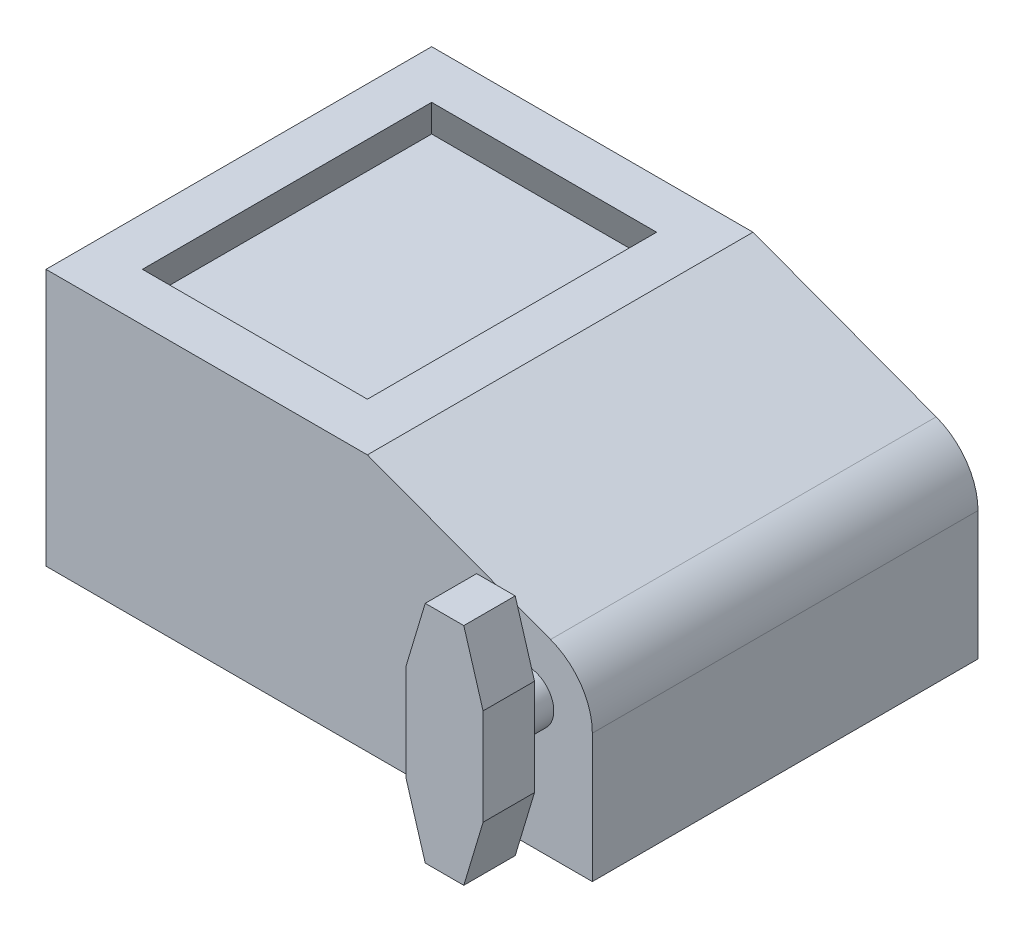
ISO-10303-21;
HEADER;
FILE_DESCRIPTION(('STEP AP214'),'2;1');
FILE_NAME('part.step','',(''),(''),'','','');
FILE_SCHEMA(('AUTOMOTIVE_DESIGN { 1 0 10303 214 1 1 1 1 }'));
ENDSEC;
DATA;
#1=APPLICATION_CONTEXT('core data for automotive mechanical design processes');
#2=APPLICATION_PROTOCOL_DEFINITION('international standard','automotive_design',2000,#1);
#3=PRODUCT_CONTEXT('',#1,'mechanical');
#4=PRODUCT('Part','Part','',(#3));
#5=PRODUCT_RELATED_PRODUCT_CATEGORY('part','',(#4));
#6=PRODUCT_DEFINITION_FORMATION('','',#4);
#7=PRODUCT_DEFINITION_CONTEXT('part definition',#1,'design');
#8=PRODUCT_DEFINITION('design','',#6,#7);
#9=PRODUCT_DEFINITION_SHAPE('','',#8);
#10=(LENGTH_UNIT() NAMED_UNIT(*) SI_UNIT(.MILLI.,.METRE.));
#11=(NAMED_UNIT(*) PLANE_ANGLE_UNIT() SI_UNIT($,.RADIAN.));
#12=(NAMED_UNIT(*) SI_UNIT($,.STERADIAN.) SOLID_ANGLE_UNIT());
#13=UNCERTAINTY_MEASURE_WITH_UNIT(LENGTH_MEASURE(1.E-05),#10,'distance_accuracy_value','');
#14=(GEOMETRIC_REPRESENTATION_CONTEXT(3) GLOBAL_UNCERTAINTY_ASSIGNED_CONTEXT((#13)) GLOBAL_UNIT_ASSIGNED_CONTEXT((#10,
#11,#12)) REPRESENTATION_CONTEXT('',''));
#15=CARTESIAN_POINT('',(0.,0.,0.));
#16=DIRECTION('',(0.,0.,1.));
#17=DIRECTION('',(1.,0.,0.));
#18=AXIS2_PLACEMENT_3D('',#15,#16,#17);
#19=CARTESIAN_POINT('',(0.,40.,0.));
#20=DIRECTION('',(0.,-1.,0.));
#21=DIRECTION('',(0.,0.,-1.));
#22=AXIS2_PLACEMENT_3D('',#19,#20,#21);
#23=PLANE('',#22);
#24=DIRECTION('',(0.,0.,-1.));
#25=VECTOR('',#24,1.);
#26=CARTESIAN_POINT('',(25.,40.,30.));
#27=LINE('',#26,#25);
#28=CARTESIAN_POINT('',(25.,40.,30.));
#29=VERTEX_POINT('',#28);
#30=CARTESIAN_POINT('',(25.,40.,-30.));
#31=VERTEX_POINT('',#30);
#32=EDGE_CURVE('E250',#29,#31,#27,.T.);
#33=ORIENTED_EDGE('',*,*,#32,.T.);
#34=DIRECTION('',(-1.,0.,0.));
#35=VECTOR('',#34,1.);
#36=CARTESIAN_POINT('',(-25.,40.,-30.));
#37=LINE('',#36,#35);
#38=CARTESIAN_POINT('',(-25.,40.,-30.));
#39=VERTEX_POINT('',#38);
#40=EDGE_CURVE('E253',#31,#39,#37,.T.);
#41=ORIENTED_EDGE('',*,*,#40,.T.);
#42=DIRECTION('',(0.,0.,1.));
#43=VECTOR('',#42,1.);
#44=CARTESIAN_POINT('',(-25.,40.,30.));
#45=LINE('',#44,#43);
#46=CARTESIAN_POINT('',(-25.,40.,30.));
#47=VERTEX_POINT('',#46);
#48=EDGE_CURVE('E256',#39,#47,#45,.T.);
#49=ORIENTED_EDGE('',*,*,#48,.T.);
#50=DIRECTION('',(1.,0.,0.));
#51=VECTOR('',#50,1.);
#52=CARTESIAN_POINT('',(-25.,40.,30.));
#53=LINE('',#52,#51);
#54=EDGE_CURVE('E258',#47,#29,#53,.T.);
#55=ORIENTED_EDGE('',*,*,#54,.T.);
#56=EDGE_LOOP('',(#33,#41,#49,#55));
#57=FACE_BOUND('',#56,.T.);
#58=DIRECTION('',(0.,0.,-1.));
#59=VECTOR('',#58,1.);
#60=CARTESIAN_POINT('',(-17.5,40.,22.5));
#61=LINE('',#60,#59);
#62=CARTESIAN_POINT('',(-17.5,40.,22.5));
#63=VERTEX_POINT('',#62);
#64=CARTESIAN_POINT('',(-17.5,40.,-22.5));
#65=VERTEX_POINT('',#64);
#66=EDGE_CURVE('E189',#63,#65,#61,.T.);
#67=ORIENTED_EDGE('',*,*,#66,.T.);
#68=DIRECTION('',(1.,0.,0.));
#69=VECTOR('',#68,1.);
#70=CARTESIAN_POINT('',(-17.5,40.,-22.5));
#71=LINE('',#70,#69);
#72=CARTESIAN_POINT('',(17.5,40.,-22.5));
#73=VERTEX_POINT('',#72);
#74=EDGE_CURVE('E178',#65,#73,#71,.T.);
#75=ORIENTED_EDGE('',*,*,#74,.T.);
#76=DIRECTION('',(0.,0.,-1.));
#77=VECTOR('',#76,1.);
#78=CARTESIAN_POINT('',(17.5,40.,22.5));
#79=LINE('',#78,#77);
#80=CARTESIAN_POINT('',(17.5,40.,22.5));
#81=VERTEX_POINT('',#80);
#82=EDGE_CURVE('E188',#81,#73,#79,.T.);
#83=ORIENTED_EDGE('',*,*,#82,.F.);
#84=DIRECTION('',(1.,0.,0.));
#85=VECTOR('',#84,1.);
#86=CARTESIAN_POINT('',(-17.5,40.,22.5));
#87=LINE('',#86,#85);
#88=EDGE_CURVE('E201',#63,#81,#87,.T.);
#89=ORIENTED_EDGE('',*,*,#88,.F.);
#90=EDGE_LOOP('',(#67,#75,#83,#89));
#91=FACE_BOUND('',#90,.T.);
#92=ADVANCED_FACE('F53',(#57,#91),#23,.F.);
#93=CARTESIAN_POINT('',(-25.,40.,-30.));
#94=DIRECTION('',(0.,0.,1.));
#95=DIRECTION('',(1.,0.,0.));
#96=AXIS2_PLACEMENT_3D('',#93,#94,#95);
#97=PLANE('',#96);
#98=DIRECTION('',(-1.,0.,0.));
#99=VECTOR('',#98,1.);
#100=CARTESIAN_POINT('',(-25.,0.,-30.));
#101=LINE('',#100,#99);
#102=CARTESIAN_POINT('',(60.,0.,-30.));
#103=VERTEX_POINT('',#102);
#104=CARTESIAN_POINT('',(-25.,0.,-30.));
#105=VERTEX_POINT('',#104);
#106=EDGE_CURVE('E228',#103,#105,#101,.T.);
#107=ORIENTED_EDGE('',*,*,#106,.T.);
#108=DIRECTION('',(0.,-1.,0.));
#109=VECTOR('',#108,1.);
#110=CARTESIAN_POINT('',(-25.,40.,-30.));
#111=LINE('',#110,#109);
#112=EDGE_CURVE('E267',#39,#105,#111,.T.);
#113=ORIENTED_EDGE('',*,*,#112,.F.);
#114=ORIENTED_EDGE('',*,*,#40,.F.);
#115=DIRECTION('',(-0.936922259792466,0.349537807833973,0.));
#116=VECTOR('',#115,1.);
#117=CARTESIAN_POINT('',(16.1540070895829,43.3001766557526,-30.));
#118=LINE('',#117,#116);
#119=CARTESIAN_POINT('',(53.4953780783397,29.3692225979247,-30.));
#120=VERTEX_POINT('',#119);
#121=EDGE_CURVE('E229',#120,#31,#118,.T.);
#122=ORIENTED_EDGE('',*,*,#121,.F.);
#123=CARTESIAN_POINT('',(50.,20.,-30.));
#124=DIRECTION('',(0.,0.,1.));
#125=DIRECTION('',(1.,0.,0.));
#126=AXIS2_PLACEMENT_3D('',#123,#124,#125);
#127=CIRCLE('',#126,10.);
#128=CARTESIAN_POINT('',(60.,20.,-30.));
#129=VERTEX_POINT('',#128);
#130=EDGE_CURVE('E234',#120,#129,#127,.F.);
#131=ORIENTED_EDGE('',*,*,#130,.T.);
#132=DIRECTION('',(0.,1.,0.));
#133=VECTOR('',#132,1.);
#134=CARTESIAN_POINT('',(60.,0.,-30.));
#135=LINE('',#134,#133);
#136=EDGE_CURVE('E225',#103,#129,#135,.T.);
#137=ORIENTED_EDGE('',*,*,#136,.F.);
#138=EDGE_LOOP('',(#107,#113,#114,#122,#131,#137));
#139=FACE_BOUND('',#138,.T.);
#140=ADVANCED_FACE('F362',(#139),#97,.F.);
#141=CARTESIAN_POINT('',(-25.,40.,30.));
#142=DIRECTION('',(1.,0.,0.));
#143=DIRECTION('',(0.,0.,-1.));
#144=AXIS2_PLACEMENT_3D('',#141,#142,#143);
#145=PLANE('',#144);
#146=DIRECTION('',(0.,0.,1.));
#147=VECTOR('',#146,1.);
#148=CARTESIAN_POINT('',(-25.,0.,30.));
#149=LINE('',#148,#147);
#150=CARTESIAN_POINT('',(-25.,0.,30.));
#151=VERTEX_POINT('',#150);
#152=EDGE_CURVE('E262',#105,#151,#149,.T.);
#153=ORIENTED_EDGE('',*,*,#152,.T.);
#154=DIRECTION('',(0.,-1.,0.));
#155=VECTOR('',#154,1.);
#156=CARTESIAN_POINT('',(-25.,40.,30.));
#157=LINE('',#156,#155);
#158=EDGE_CURVE('E260',#47,#151,#157,.T.);
#159=ORIENTED_EDGE('',*,*,#158,.F.);
#160=ORIENTED_EDGE('',*,*,#48,.F.);
#161=ORIENTED_EDGE('',*,*,#112,.T.);
#162=EDGE_LOOP('',(#153,#159,#160,#161));
#163=FACE_BOUND('',#162,.T.);
#164=ADVANCED_FACE('F368',(#163),#145,.F.);
#165=CARTESIAN_POINT('',(-25.,40.,30.));
#166=DIRECTION('',(0.,0.,-1.));
#167=DIRECTION('',(-1.,0.,0.));
#168=AXIS2_PLACEMENT_3D('',#165,#166,#167);
#169=PLANE('',#168);
#170=CARTESIAN_POINT('',(50.,20.,30.));
#171=DIRECTION('',(0.,0.,-1.));
#172=DIRECTION('',(-1.,0.,0.));
#173=AXIS2_PLACEMENT_3D('',#170,#171,#172);
#174=CIRCLE('',#173,4.00000000000001);
#175=CARTESIAN_POINT('',(46.,20.,30.));
#176=VERTEX_POINT('',#175);
#177=EDGE_CURVE('E270',#176,#176,#174,.F.);
#178=ORIENTED_EDGE('',*,*,#177,.F.);
#179=EDGE_LOOP('',(#178));
#180=FACE_BOUND('',#179,.T.);
#181=DIRECTION('',(1.,0.,0.));
#182=VECTOR('',#181,1.);
#183=CARTESIAN_POINT('',(-25.,0.,30.));
#184=LINE('',#183,#182);
#185=CARTESIAN_POINT('',(60.,0.,30.));
#186=VERTEX_POINT('',#185);
#187=EDGE_CURVE('E254',#151,#186,#184,.T.);
#188=ORIENTED_EDGE('',*,*,#187,.T.);
#189=DIRECTION('',(0.,-1.,0.));
#190=VECTOR('',#189,1.);
#191=CARTESIAN_POINT('',(60.,0.,30.));
#192=LINE('',#191,#190);
#193=CARTESIAN_POINT('',(60.,20.,30.));
#194=VERTEX_POINT('',#193);
#195=EDGE_CURVE('E233',#194,#186,#192,.T.);
#196=ORIENTED_EDGE('',*,*,#195,.F.);
#197=CARTESIAN_POINT('',(50.,20.,30.));
#198=DIRECTION('',(0.,0.,1.));
#199=DIRECTION('',(1.,0.,0.));
#200=AXIS2_PLACEMENT_3D('',#197,#198,#199);
#201=CIRCLE('',#200,10.);
#202=CARTESIAN_POINT('',(53.4953780783397,29.3692225979247,30.));
#203=VERTEX_POINT('',#202);
#204=EDGE_CURVE('E197',#194,#203,#201,.T.);
#205=ORIENTED_EDGE('',*,*,#204,.T.);
#206=DIRECTION('',(0.936922259792466,-0.349537807833973,0.));
#207=VECTOR('',#206,1.);
#208=CARTESIAN_POINT('',(16.1540070895829,43.3001766557526,30.));
#209=LINE('',#208,#207);
#210=EDGE_CURVE('E230',#29,#203,#209,.T.);
#211=ORIENTED_EDGE('',*,*,#210,.F.);
#212=ORIENTED_EDGE('',*,*,#54,.F.);
#213=ORIENTED_EDGE('',*,*,#158,.T.);
#214=EDGE_LOOP('',(#188,#196,#205,#211,#212,#213));
#215=FACE_BOUND('',#214,.T.);
#216=ADVANCED_FACE('F379',(#180,#215),#169,.F.);
#217=CARTESIAN_POINT('',(0.,0.,0.));
#218=DIRECTION('',(0.,-1.,0.));
#219=DIRECTION('',(0.,0.,-1.));
#220=AXIS2_PLACEMENT_3D('',#217,#218,#219);
#221=PLANE('',#220);
#222=ORIENTED_EDGE('',*,*,#106,.F.);
#223=DIRECTION('',(0.,0.,1.));
#224=VECTOR('',#223,1.);
#225=CARTESIAN_POINT('',(60.,0.,-83.1507290636732));
#226=LINE('',#225,#224);
#227=EDGE_CURVE('E240',#103,#186,#226,.T.);
#228=ORIENTED_EDGE('',*,*,#227,.T.);
#229=ORIENTED_EDGE('',*,*,#187,.F.);
#230=ORIENTED_EDGE('',*,*,#152,.F.);
#231=EDGE_LOOP('',(#222,#228,#229,#230));
#232=FACE_BOUND('',#231,.T.);
#233=ADVANCED_FACE('F375',(#232),#221,.T.);
#234=CARTESIAN_POINT('',(16.1540070895829,43.3001766557526,-83.1507290636732));
#235=DIRECTION('',(-0.349537807833973,-0.936922259792466,0.));
#236=DIRECTION('',(0.936922259792466,-0.349537807833973,0.));
#237=AXIS2_PLACEMENT_3D('',#234,#235,#236);
#238=PLANE('',#237);
#239=DIRECTION('',(0.,0.,1.));
#240=VECTOR('',#239,1.);
#241=CARTESIAN_POINT('',(53.4953780783397,29.3692225979247,-83.1507290636732));
#242=LINE('',#241,#240);
#243=EDGE_CURVE('E237',#120,#203,#242,.T.);
#244=ORIENTED_EDGE('',*,*,#243,.F.);
#245=ORIENTED_EDGE('',*,*,#121,.T.);
#246=ORIENTED_EDGE('',*,*,#32,.F.);
#247=ORIENTED_EDGE('',*,*,#210,.T.);
#248=EDGE_LOOP('',(#244,#245,#246,#247));
#249=FACE_BOUND('',#248,.T.);
#250=ADVANCED_FACE('F378',(#249),#238,.F.);
#251=CARTESIAN_POINT('',(60.,0.,-83.1507290636732));
#252=DIRECTION('',(-1.,0.,0.));
#253=DIRECTION('',(0.,-1.,0.));
#254=AXIS2_PLACEMENT_3D('',#251,#252,#253);
#255=PLANE('',#254);
#256=ORIENTED_EDGE('',*,*,#227,.F.);
#257=ORIENTED_EDGE('',*,*,#136,.T.);
#258=DIRECTION('',(0.,0.,1.));
#259=VECTOR('',#258,1.);
#260=CARTESIAN_POINT('',(60.,20.,-83.1507290636732));
#261=LINE('',#260,#259);
#262=EDGE_CURVE('E238',#129,#194,#261,.T.);
#263=ORIENTED_EDGE('',*,*,#262,.T.);
#264=ORIENTED_EDGE('',*,*,#195,.T.);
#265=EDGE_LOOP('',(#256,#257,#263,#264));
#266=FACE_BOUND('',#265,.T.);
#267=ADVANCED_FACE('F417',(#266),#255,.F.);
#268=CARTESIAN_POINT('',(50.,20.,-83.1507290636732));
#269=DIRECTION('',(0.,0.,1.));
#270=DIRECTION('',(1.,0.,0.));
#271=AXIS2_PLACEMENT_3D('',#268,#269,#270);
#272=CYLINDRICAL_SURFACE('',#271,10.);
#273=ORIENTED_EDGE('',*,*,#130,.F.);
#274=ORIENTED_EDGE('',*,*,#243,.T.);
#275=ORIENTED_EDGE('',*,*,#204,.F.);
#276=ORIENTED_EDGE('',*,*,#262,.F.);
#277=EDGE_LOOP('',(#273,#274,#275,#276));
#278=FACE_BOUND('',#277,.T.);
#279=ADVANCED_FACE('F373',(#278),#272,.T.);
#280=CARTESIAN_POINT('',(-17.5,40.,22.5));
#281=DIRECTION('',(-0.90630778703665,0.4226182617407,0.));
#282=DIRECTION('',(-0.4226182617407,-0.90630778703665,0.));
#283=AXIS2_PLACEMENT_3D('',#280,#281,#282);
#284=PLANE('',#283);
#285=ORIENTED_EDGE('',*,*,#66,.F.);
#286=DIRECTION('',(-0.389281620635025,-0.834817129478988,0.389281620635025));
#287=VECTOR('',#286,1.);
#288=CARTESIAN_POINT('',(-17.5,40.,22.5));
#289=LINE('',#288,#287);
#290=CARTESIAN_POINT('',(-21.23046126524,32.,26.23046126524));
#291=VERTEX_POINT('',#290);
#292=EDGE_CURVE('E211',#291,#63,#289,.F.);
#293=ORIENTED_EDGE('',*,*,#292,.F.);
#294=DIRECTION('',(0.,0.,1.));
#295=VECTOR('',#294,1.);
#296=CARTESIAN_POINT('',(-21.23046126524,32.,22.5));
#297=LINE('',#296,#295);
#298=CARTESIAN_POINT('',(-21.23046126524,32.,-26.23046126524));
#299=VERTEX_POINT('',#298);
#300=EDGE_CURVE('E196',#291,#299,#297,.F.);
#301=ORIENTED_EDGE('',*,*,#300,.T.);
#302=DIRECTION('',(0.389281620635025,0.834817129478988,0.389281620635025));
#303=VECTOR('',#302,1.);
#304=CARTESIAN_POINT('',(-17.5,40.,-22.5));
#305=LINE('',#304,#303);
#306=EDGE_CURVE('E181',#299,#65,#305,.T.);
#307=ORIENTED_EDGE('',*,*,#306,.T.);
#308=EDGE_LOOP('',(#285,#293,#301,#307));
#309=FACE_BOUND('',#308,.T.);
#310=ADVANCED_FACE('F193',(#309),#284,.F.);
#311=CARTESIAN_POINT('',(-17.5,40.,-22.5));
#312=DIRECTION('',(0.,0.4226182617407,-0.90630778703665));
#313=DIRECTION('',(0.,0.90630778703665,0.4226182617407));
#314=AXIS2_PLACEMENT_3D('',#311,#312,#313);
#315=PLANE('',#314);
#316=ORIENTED_EDGE('',*,*,#74,.F.);
#317=ORIENTED_EDGE('',*,*,#306,.F.);
#318=DIRECTION('',(-1.,0.,0.));
#319=VECTOR('',#318,1.);
#320=CARTESIAN_POINT('',(-17.5,32.,-26.23046126524));
#321=LINE('',#320,#319);
#322=CARTESIAN_POINT('',(21.23046126524,32.,-26.23046126524));
#323=VERTEX_POINT('',#322);
#324=EDGE_CURVE('E218',#299,#323,#321,.F.);
#325=ORIENTED_EDGE('',*,*,#324,.T.);
#326=DIRECTION('',(0.389281620635025,-0.834817129478988,-0.389281620635025));
#327=VECTOR('',#326,1.);
#328=CARTESIAN_POINT('',(12.1960936942519,51.3742637784111,-17.1960936942519));
#329=LINE('',#328,#327);
#330=EDGE_CURVE('E183',#323,#73,#329,.F.);
#331=ORIENTED_EDGE('',*,*,#330,.T.);
#332=EDGE_LOOP('',(#316,#317,#325,#331));
#333=FACE_BOUND('',#332,.T.);
#334=ADVANCED_FACE('F180',(#333),#315,.F.);
#335=CARTESIAN_POINT('',(17.5,40.,22.5));
#336=DIRECTION('',(0.90630778703665,0.4226182617407,0.));
#337=DIRECTION('',(-0.4226182617407,0.90630778703665,0.));
#338=AXIS2_PLACEMENT_3D('',#335,#336,#337);
#339=PLANE('',#338);
#340=ORIENTED_EDGE('',*,*,#82,.T.);
#341=ORIENTED_EDGE('',*,*,#330,.F.);
#342=DIRECTION('',(0.,0.,-1.));
#343=VECTOR('',#342,1.);
#344=CARTESIAN_POINT('',(21.23046126524,32.,22.5));
#345=LINE('',#344,#343);
#346=CARTESIAN_POINT('',(21.23046126524,32.,26.23046126524));
#347=VERTEX_POINT('',#346);
#348=EDGE_CURVE('E220',#347,#323,#345,.T.);
#349=ORIENTED_EDGE('',*,*,#348,.F.);
#350=DIRECTION('',(-0.389281620635025,0.834817129478988,-0.389281620635025));
#351=VECTOR('',#350,1.);
#352=CARTESIAN_POINT('',(12.1960936942519,51.3742637784111,17.1960936942519));
#353=LINE('',#352,#351);
#354=EDGE_CURVE('E213',#347,#81,#353,.T.);
#355=ORIENTED_EDGE('',*,*,#354,.T.);
#356=EDGE_LOOP('',(#340,#341,#349,#355));
#357=FACE_BOUND('',#356,.T.);
#358=ADVANCED_FACE('F420',(#357),#339,.F.);
#359=CARTESIAN_POINT('',(-17.5,40.,22.5));
#360=DIRECTION('',(0.,0.4226182617407,0.90630778703665));
#361=DIRECTION('',(0.,-0.90630778703665,0.4226182617407));
#362=AXIS2_PLACEMENT_3D('',#359,#360,#361);
#363=PLANE('',#362);
#364=ORIENTED_EDGE('',*,*,#88,.T.);
#365=ORIENTED_EDGE('',*,*,#354,.F.);
#366=DIRECTION('',(1.,0.,0.));
#367=VECTOR('',#366,1.);
#368=CARTESIAN_POINT('',(-17.5,32.,26.23046126524));
#369=LINE('',#368,#367);
#370=EDGE_CURVE('E214',#291,#347,#369,.T.);
#371=ORIENTED_EDGE('',*,*,#370,.F.);
#372=ORIENTED_EDGE('',*,*,#292,.T.);
#373=EDGE_LOOP('',(#364,#365,#371,#372));
#374=FACE_BOUND('',#373,.T.);
#375=ADVANCED_FACE('F413',(#374),#363,.F.);
#376=CARTESIAN_POINT('',(0.,32.,0.));
#377=DIRECTION('',(0.,-1.,0.));
#378=DIRECTION('',(0.,0.,-1.));
#379=AXIS2_PLACEMENT_3D('',#376,#377,#378);
#380=PLANE('',#379);
#381=ORIENTED_EDGE('',*,*,#300,.F.);
#382=ORIENTED_EDGE('',*,*,#370,.T.);
#383=ORIENTED_EDGE('',*,*,#348,.T.);
#384=ORIENTED_EDGE('',*,*,#324,.F.);
#385=EDGE_LOOP('',(#381,#382,#383,#384));
#386=FACE_BOUND('',#385,.T.);
#387=ADVANCED_FACE('F409',(#386),#380,.F.);
#388=CARTESIAN_POINT('',(50.,20.,35.));
#389=DIRECTION('',(0.,0.,-1.));
#390=DIRECTION('',(-1.,0.,0.));
#391=AXIS2_PLACEMENT_3D('',#388,#389,#390);
#392=CYLINDRICAL_SURFACE('',#391,4.00000000000001);
#393=CARTESIAN_POINT('',(50.,20.,35.));
#394=DIRECTION('',(0.,0.,1.));
#395=DIRECTION('',(1.,0.,0.));
#396=AXIS2_PLACEMENT_3D('',#393,#394,#395);
#397=CIRCLE('',#396,4.00000000000001);
#398=CARTESIAN_POINT('',(54.,20.,35.));
#399=VERTEX_POINT('',#398);
#400=EDGE_CURVE('E202',#399,#399,#397,.T.);
#401=ORIENTED_EDGE('',*,*,#400,.F.);
#402=EDGE_LOOP('',(#401));
#403=FACE_BOUND('',#402,.T.);
#404=ORIENTED_EDGE('',*,*,#177,.T.);
#405=EDGE_LOOP('',(#404));
#406=FACE_BOUND('',#405,.T.);
#407=ADVANCED_FACE('F406',(#403,#406),#392,.T.);
#408=CARTESIAN_POINT('',(56.,2.5,43.));
#409=DIRECTION('',(-1.,0.,0.));
#410=DIRECTION('',(0.,0.,1.));
#411=AXIS2_PLACEMENT_3D('',#408,#409,#410);
#412=PLANE('',#411);
#413=DIRECTION('',(0.,1.,0.));
#414=VECTOR('',#413,1.);
#415=CARTESIAN_POINT('',(56.,2.5,35.));
#416=LINE('',#415,#414);
#417=CARTESIAN_POINT('',(56.,12.5000000000001,35.));
#418=VERTEX_POINT('',#417);
#419=CARTESIAN_POINT('',(56.,27.4999999999999,35.));
#420=VERTEX_POINT('',#419);
#421=EDGE_CURVE('E321',#418,#420,#416,.T.);
#422=ORIENTED_EDGE('',*,*,#421,.T.);
#423=DIRECTION('',(0.,0.,1.));
#424=VECTOR('',#423,1.);
#425=CARTESIAN_POINT('',(56.,27.4999999999999,43.));
#426=LINE('',#425,#424);
#427=CARTESIAN_POINT('',(56.,27.4999999999999,43.));
#428=VERTEX_POINT('',#427);
#429=EDGE_CURVE('E12',#420,#428,#426,.T.);
#430=ORIENTED_EDGE('',*,*,#429,.T.);
#431=DIRECTION('',(0.,1.,0.));
#432=VECTOR('',#431,1.);
#433=CARTESIAN_POINT('',(56.,2.5,43.));
#434=LINE('',#433,#432);
#435=CARTESIAN_POINT('',(56.,12.5000000000001,43.));
#436=VERTEX_POINT('',#435);
#437=EDGE_CURVE('E328',#436,#428,#434,.T.);
#438=ORIENTED_EDGE('',*,*,#437,.F.);
#439=DIRECTION('',(0.,0.,-1.));
#440=VECTOR('',#439,1.);
#441=CARTESIAN_POINT('',(56.,12.5000000000001,43.));
#442=LINE('',#441,#440);
#443=EDGE_CURVE('E273',#436,#418,#442,.T.);
#444=ORIENTED_EDGE('',*,*,#443,.T.);
#445=EDGE_LOOP('',(#422,#430,#438,#444));
#446=FACE_BOUND('',#445,.T.);
#447=ADVANCED_FACE('F345',(#446),#412,.F.);
#448=CARTESIAN_POINT('',(44.,37.5,43.));
#449=DIRECTION('',(0.,-1.,0.));
#450=DIRECTION('',(0.,0.,-1.));
#451=AXIS2_PLACEMENT_3D('',#448,#449,#450);
#452=PLANE('',#451);
#453=DIRECTION('',(-1.,0.,0.));
#454=VECTOR('',#453,1.);
#455=CARTESIAN_POINT('',(44.,37.5,43.));
#456=LINE('',#455,#454);
#457=CARTESIAN_POINT('',(53.,37.5,43.));
#458=VERTEX_POINT('',#457);
#459=CARTESIAN_POINT('',(47.,37.5,43.));
#460=VERTEX_POINT('',#459);
#461=EDGE_CURVE('E312',#458,#460,#456,.T.);
#462=ORIENTED_EDGE('',*,*,#461,.F.);
#463=DIRECTION('',(0.,0.,-1.));
#464=VECTOR('',#463,1.);
#465=CARTESIAN_POINT('',(53.,37.5,43.));
#466=LINE('',#465,#464);
#467=CARTESIAN_POINT('',(53.,37.5,35.));
#468=VERTEX_POINT('',#467);
#469=EDGE_CURVE('E61',#458,#468,#466,.T.);
#470=ORIENTED_EDGE('',*,*,#469,.T.);
#471=DIRECTION('',(-1.,0.,0.));
#472=VECTOR('',#471,1.);
#473=CARTESIAN_POINT('',(44.,37.5,35.));
#474=LINE('',#473,#472);
#475=CARTESIAN_POINT('',(47.,37.5,35.));
#476=VERTEX_POINT('',#475);
#477=EDGE_CURVE('E311',#468,#476,#474,.T.);
#478=ORIENTED_EDGE('',*,*,#477,.T.);
#479=DIRECTION('',(0.,0.,1.));
#480=VECTOR('',#479,1.);
#481=CARTESIAN_POINT('',(47.,37.5,43.));
#482=LINE('',#481,#480);
#483=EDGE_CURVE('E292',#476,#460,#482,.T.);
#484=ORIENTED_EDGE('',*,*,#483,.T.);
#485=EDGE_LOOP('',(#462,#470,#478,#484));
#486=FACE_BOUND('',#485,.T.);
#487=ADVANCED_FACE('F310',(#486),#452,.F.);
#488=CARTESIAN_POINT('',(44.,2.5,43.));
#489=DIRECTION('',(1.,0.,0.));
#490=DIRECTION('',(0.,0.,-1.));
#491=AXIS2_PLACEMENT_3D('',#488,#489,#490);
#492=PLANE('',#491);
#493=DIRECTION('',(0.,-1.,0.));
#494=VECTOR('',#493,1.);
#495=CARTESIAN_POINT('',(44.,2.5,35.));
#496=LINE('',#495,#494);
#497=CARTESIAN_POINT('',(44.,27.4999999999999,35.));
#498=VERTEX_POINT('',#497);
#499=CARTESIAN_POINT('',(44.,12.5000000000001,35.));
#500=VERTEX_POINT('',#499);
#501=EDGE_CURVE('E320',#498,#500,#496,.T.);
#502=ORIENTED_EDGE('',*,*,#501,.T.);
#503=DIRECTION('',(0.,0.,1.));
#504=VECTOR('',#503,1.);
#505=CARTESIAN_POINT('',(44.,12.5000000000001,43.));
#506=LINE('',#505,#504);
#507=CARTESIAN_POINT('',(44.,12.5000000000001,43.));
#508=VERTEX_POINT('',#507);
#509=EDGE_CURVE('E302',#500,#508,#506,.T.);
#510=ORIENTED_EDGE('',*,*,#509,.T.);
#511=DIRECTION('',(0.,-1.,0.));
#512=VECTOR('',#511,1.);
#513=CARTESIAN_POINT('',(44.,2.5,43.));
#514=LINE('',#513,#512);
#515=CARTESIAN_POINT('',(44.,27.4999999999999,43.));
#516=VERTEX_POINT('',#515);
#517=EDGE_CURVE('E331',#516,#508,#514,.T.);
#518=ORIENTED_EDGE('',*,*,#517,.F.);
#519=DIRECTION('',(0.,0.,-1.));
#520=VECTOR('',#519,1.);
#521=CARTESIAN_POINT('',(44.,27.4999999999999,43.));
#522=LINE('',#521,#520);
#523=EDGE_CURVE('E289',#516,#498,#522,.T.);
#524=ORIENTED_EDGE('',*,*,#523,.T.);
#525=EDGE_LOOP('',(#502,#510,#518,#524));
#526=FACE_BOUND('',#525,.T.);
#527=ADVANCED_FACE('F349',(#526),#492,.F.);
#528=CARTESIAN_POINT('',(44.,2.5,43.));
#529=DIRECTION('',(0.,1.,0.));
#530=DIRECTION('',(0.,0.,1.));
#531=AXIS2_PLACEMENT_3D('',#528,#529,#530);
#532=PLANE('',#531);
#533=DIRECTION('',(1.,0.,0.));
#534=VECTOR('',#533,1.);
#535=CARTESIAN_POINT('',(44.,2.5,43.));
#536=LINE('',#535,#534);
#537=CARTESIAN_POINT('',(47.,2.5,43.));
#538=VERTEX_POINT('',#537);
#539=CARTESIAN_POINT('',(53.,2.5,43.));
#540=VERTEX_POINT('',#539);
#541=EDGE_CURVE('E205',#538,#540,#536,.T.);
#542=ORIENTED_EDGE('',*,*,#541,.F.);
#543=DIRECTION('',(0.,0.,-1.));
#544=VECTOR('',#543,1.);
#545=CARTESIAN_POINT('',(47.,2.5,43.));
#546=LINE('',#545,#544);
#547=CARTESIAN_POINT('',(47.,2.5,35.));
#548=VERTEX_POINT('',#547);
#549=EDGE_CURVE('E295',#538,#548,#546,.T.);
#550=ORIENTED_EDGE('',*,*,#549,.T.);
#551=DIRECTION('',(1.,0.,0.));
#552=VECTOR('',#551,1.);
#553=CARTESIAN_POINT('',(44.,2.5,35.));
#554=LINE('',#553,#552);
#555=CARTESIAN_POINT('',(53.,2.5,35.));
#556=VERTEX_POINT('',#555);
#557=EDGE_CURVE('E324',#548,#556,#554,.T.);
#558=ORIENTED_EDGE('',*,*,#557,.T.);
#559=DIRECTION('',(0.,0.,1.));
#560=VECTOR('',#559,1.);
#561=CARTESIAN_POINT('',(53.,2.5,43.));
#562=LINE('',#561,#560);
#563=EDGE_CURVE('E282',#556,#540,#562,.T.);
#564=ORIENTED_EDGE('',*,*,#563,.T.);
#565=EDGE_LOOP('',(#542,#550,#558,#564));
#566=FACE_BOUND('',#565,.T.);
#567=ADVANCED_FACE('F341',(#566),#532,.F.);
#568=CARTESIAN_POINT('',(0.,0.,43.));
#569=DIRECTION('',(0.,0.,-1.));
#570=DIRECTION('',(-1.,0.,0.));
#571=AXIS2_PLACEMENT_3D('',#568,#569,#570);
#572=PLANE('',#571);
#573=ORIENTED_EDGE('',*,*,#517,.T.);
#574=DIRECTION('',(-0.287347885566343,0.957826285221152,0.));
#575=VECTOR('',#574,1.);
#576=CARTESIAN_POINT('',(47.,2.5,43.));
#577=LINE('',#576,#575);
#578=EDGE_CURVE('E305',#508,#538,#577,.F.);
#579=ORIENTED_EDGE('',*,*,#578,.T.);
#580=ORIENTED_EDGE('',*,*,#541,.T.);
#581=DIRECTION('',(-0.287347885566342,-0.957826285221152,0.));
#582=VECTOR('',#581,1.);
#583=CARTESIAN_POINT('',(56.,12.5000000000001,43.));
#584=LINE('',#583,#582);
#585=EDGE_CURVE('E287',#540,#436,#584,.F.);
#586=ORIENTED_EDGE('',*,*,#585,.T.);
#587=ORIENTED_EDGE('',*,*,#437,.T.);
#588=DIRECTION('',(0.287347885566343,-0.957826285221152,0.));
#589=VECTOR('',#588,1.);
#590=CARTESIAN_POINT('',(53.,37.5,43.));
#591=LINE('',#590,#589);
#592=EDGE_CURVE('E68',#428,#458,#591,.F.);
#593=ORIENTED_EDGE('',*,*,#592,.T.);
#594=ORIENTED_EDGE('',*,*,#461,.T.);
#595=DIRECTION('',(0.287347885566343,0.957826285221152,0.));
#596=VECTOR('',#595,1.);
#597=CARTESIAN_POINT('',(44.,27.4999999999999,43.));
#598=LINE('',#597,#596);
#599=EDGE_CURVE('E285',#460,#516,#598,.F.);
#600=ORIENTED_EDGE('',*,*,#599,.T.);
#601=EDGE_LOOP('',(#573,#579,#580,#586,#587,#593,#594,#600));
#602=FACE_BOUND('',#601,.T.);
#603=ADVANCED_FACE('F336',(#602),#572,.F.);
#604=CARTESIAN_POINT('',(0.,0.,35.));
#605=DIRECTION('',(0.,0.,-1.));
#606=DIRECTION('',(-1.,0.,0.));
#607=AXIS2_PLACEMENT_3D('',#604,#605,#606);
#608=PLANE('',#607);
#609=ORIENTED_EDGE('',*,*,#400,.T.);
#610=EDGE_LOOP('',(#609));
#611=FACE_BOUND('',#610,.T.);
#612=ORIENTED_EDGE('',*,*,#557,.F.);
#613=DIRECTION('',(0.287347885566343,-0.957826285221152,0.));
#614=VECTOR('',#613,1.);
#615=CARTESIAN_POINT('',(43.8073394495414,13.1422018348623,35.));
#616=LINE('',#615,#614);
#617=EDGE_CURVE('E300',#548,#500,#616,.F.);
#618=ORIENTED_EDGE('',*,*,#617,.T.);
#619=ORIENTED_EDGE('',*,*,#501,.F.);
#620=DIRECTION('',(-0.287347885566343,-0.957826285221152,0.));
#621=VECTOR('',#620,1.);
#622=CARTESIAN_POINT('',(32.7981651376148,-9.83944954128435,35.));
#623=LINE('',#622,#621);
#624=EDGE_CURVE('E276',#498,#476,#623,.F.);
#625=ORIENTED_EDGE('',*,*,#624,.T.);
#626=ORIENTED_EDGE('',*,*,#477,.F.);
#627=DIRECTION('',(-0.287347885566343,0.957826285221152,0.));
#628=VECTOR('',#627,1.);
#629=CARTESIAN_POINT('',(58.9449541284404,17.6834862385319,35.));
#630=LINE('',#629,#628);
#631=EDGE_CURVE('E298',#468,#420,#630,.F.);
#632=ORIENTED_EDGE('',*,*,#631,.T.);
#633=ORIENTED_EDGE('',*,*,#421,.F.);
#634=DIRECTION('',(0.287347885566342,0.957826285221152,0.));
#635=VECTOR('',#634,1.);
#636=CARTESIAN_POINT('',(47.9357798165139,-14.380733944954,35.));
#637=LINE('',#636,#635);
#638=EDGE_CURVE('E279',#418,#556,#637,.F.);
#639=ORIENTED_EDGE('',*,*,#638,.T.);
#640=EDGE_LOOP('',(#612,#618,#619,#625,#626,#632,#633,#639));
#641=FACE_BOUND('',#640,.T.);
#642=ADVANCED_FACE('F316',(#611,#641),#608,.T.);
#643=CARTESIAN_POINT('',(56.,12.5000000000001,43.));
#644=DIRECTION('',(-0.957826285221152,0.287347885566342,0.));
#645=DIRECTION('',(0.,0.,-1.));
#646=AXIS2_PLACEMENT_3D('',#643,#644,#645);
#647=PLANE('',#646);
#648=ORIENTED_EDGE('',*,*,#585,.F.);
#649=ORIENTED_EDGE('',*,*,#563,.F.);
#650=ORIENTED_EDGE('',*,*,#638,.F.);
#651=ORIENTED_EDGE('',*,*,#443,.F.);
#652=EDGE_LOOP('',(#648,#649,#650,#651));
#653=FACE_BOUND('',#652,.T.);
#654=ADVANCED_FACE('F344',(#653),#647,.F.);
#655=CARTESIAN_POINT('',(44.,27.4999999999999,43.));
#656=DIRECTION('',(0.957826285221152,-0.287347885566343,0.));
#657=DIRECTION('',(0.,0.,-1.));
#658=AXIS2_PLACEMENT_3D('',#655,#656,#657);
#659=PLANE('',#658);
#660=ORIENTED_EDGE('',*,*,#599,.F.);
#661=ORIENTED_EDGE('',*,*,#483,.F.);
#662=ORIENTED_EDGE('',*,*,#624,.F.);
#663=ORIENTED_EDGE('',*,*,#523,.F.);
#664=EDGE_LOOP('',(#660,#661,#662,#663));
#665=FACE_BOUND('',#664,.T.);
#666=ADVANCED_FACE('F354',(#665),#659,.F.);
#667=CARTESIAN_POINT('',(47.,2.5,43.));
#668=DIRECTION('',(0.957826285221152,0.287347885566343,0.));
#669=DIRECTION('',(0.,0.,-1.));
#670=AXIS2_PLACEMENT_3D('',#667,#668,#669);
#671=PLANE('',#670);
#672=ORIENTED_EDGE('',*,*,#578,.F.);
#673=ORIENTED_EDGE('',*,*,#509,.F.);
#674=ORIENTED_EDGE('',*,*,#617,.F.);
#675=ORIENTED_EDGE('',*,*,#549,.F.);
#676=EDGE_LOOP('',(#672,#673,#674,#675));
#677=FACE_BOUND('',#676,.T.);
#678=ADVANCED_FACE('F352',(#677),#671,.F.);
#679=CARTESIAN_POINT('',(53.,37.5,43.));
#680=DIRECTION('',(-0.957826285221152,-0.287347885566343,0.));
#681=DIRECTION('',(0.,0.,-1.));
#682=AXIS2_PLACEMENT_3D('',#679,#680,#681);
#683=PLANE('',#682);
#684=ORIENTED_EDGE('',*,*,#592,.F.);
#685=ORIENTED_EDGE('',*,*,#429,.F.);
#686=ORIENTED_EDGE('',*,*,#631,.F.);
#687=ORIENTED_EDGE('',*,*,#469,.F.);
#688=EDGE_LOOP('',(#684,#685,#686,#687));
#689=FACE_BOUND('',#688,.T.);
#690=ADVANCED_FACE('F55',(#689),#683,.F.);
#691=CLOSED_SHELL('',(#92,#140,#164,#216,#233,#250,#267,#279,#310,#334,#358,#375,#387,#407,#447,
#487,#527,#567,#603,#642,#654,#666,#678,#690));
#692=MANIFOLD_SOLID_BREP('B2',#691);
#693=ADVANCED_BREP_SHAPE_REPRESENTATION('',(#18,#692),#14);
#694=SHAPE_DEFINITION_REPRESENTATION(#9,#693);
ENDSEC;
END-ISO-10303-21;
